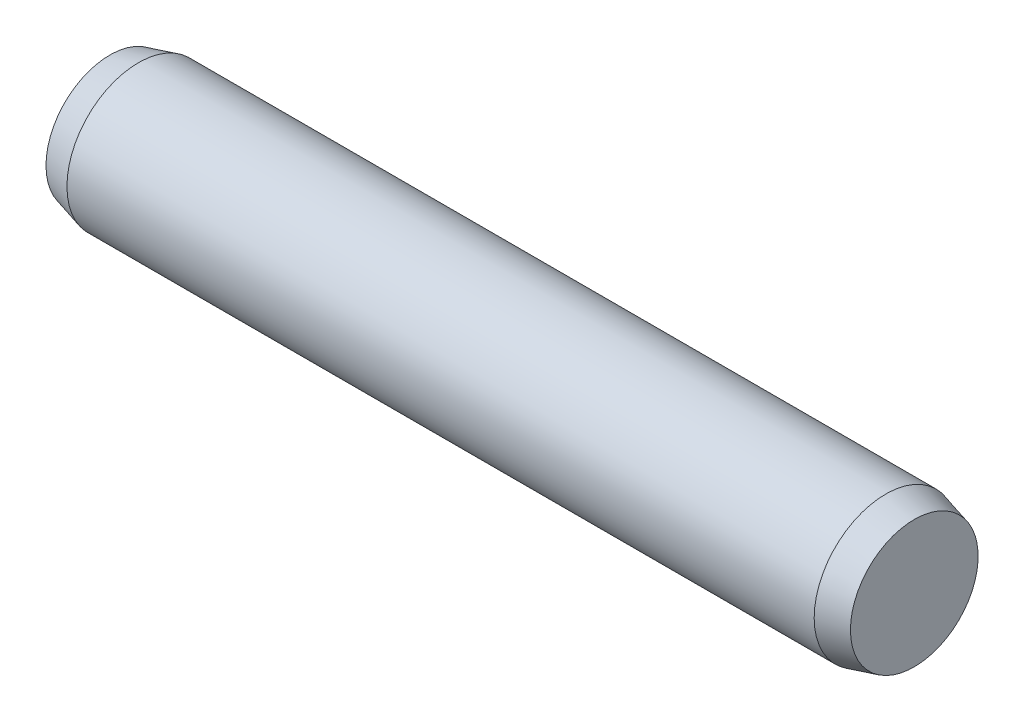
ISO-10303-21;
HEADER;
FILE_DESCRIPTION(('STEP AP214'),'2;1');
FILE_NAME('part.step','',(''),(''),'','','');
FILE_SCHEMA(('AUTOMOTIVE_DESIGN { 1 0 10303 214 1 1 1 1 }'));
ENDSEC;
DATA;
#1=APPLICATION_CONTEXT('core data for automotive mechanical design processes');
#2=APPLICATION_PROTOCOL_DEFINITION('international standard','automotive_design',2000,#1);
#3=PRODUCT_CONTEXT('',#1,'mechanical');
#4=PRODUCT('Part','Part','',(#3));
#5=PRODUCT_RELATED_PRODUCT_CATEGORY('part','',(#4));
#6=PRODUCT_DEFINITION_FORMATION('','',#4);
#7=PRODUCT_DEFINITION_CONTEXT('part definition',#1,'design');
#8=PRODUCT_DEFINITION('design','',#6,#7);
#9=PRODUCT_DEFINITION_SHAPE('','',#8);
#10=(LENGTH_UNIT() NAMED_UNIT(*) SI_UNIT(.MILLI.,.METRE.));
#11=(NAMED_UNIT(*) PLANE_ANGLE_UNIT() SI_UNIT($,.RADIAN.));
#12=(NAMED_UNIT(*) SI_UNIT($,.STERADIAN.) SOLID_ANGLE_UNIT());
#13=UNCERTAINTY_MEASURE_WITH_UNIT(LENGTH_MEASURE(1.E-05),#10,'distance_accuracy_value','');
#14=(GEOMETRIC_REPRESENTATION_CONTEXT(3) GLOBAL_UNCERTAINTY_ASSIGNED_CONTEXT((#13)) GLOBAL_UNIT_ASSIGNED_CONTEXT((#10,
#11,#12)) REPRESENTATION_CONTEXT('',''));
#15=CARTESIAN_POINT('',(0.,0.,0.));
#16=DIRECTION('',(0.,0.,1.));
#17=DIRECTION('',(1.,0.,0.));
#18=AXIS2_PLACEMENT_3D('',#15,#16,#17);
#19=CARTESIAN_POINT('',(0.,3.57128129211021,0.));
#20=DIRECTION('',(1.,0.,0.));
#21=DIRECTION('',(0.,0.,-1.));
#22=AXIS2_PLACEMENT_3D('',#19,#20,#21);
#23=PLANE('',#22);
#24=CARTESIAN_POINT('',(0.,0.,0.));
#25=DIRECTION('',(-1.,0.,0.));
#26=DIRECTION('',(0.,0.,1.));
#27=AXIS2_PLACEMENT_3D('',#24,#25,#26);
#28=CIRCLE('',#27,3.57128129211021);
#29=CARTESIAN_POINT('',(0.,0.,3.57128129211021));
#30=VERTEX_POINT('',#29);
#31=EDGE_CURVE('E51',#30,#30,#28,.T.);
#32=ORIENTED_EDGE('',*,*,#31,.T.);
#33=EDGE_LOOP('',(#32));
#34=FACE_BOUND('',#33,.T.);
#35=ADVANCED_FACE('F37',(#34),#23,.F.);
#36=CARTESIAN_POINT('',(45.,0.,0.));
#37=DIRECTION('',(-1.,0.,0.));
#38=DIRECTION('',(0.,0.,1.));
#39=AXIS2_PLACEMENT_3D('',#36,#37,#38);
#40=PLANE('',#39);
#41=CARTESIAN_POINT('',(45.,0.,0.));
#42=DIRECTION('',(-1.,0.,0.));
#43=DIRECTION('',(0.,0.,1.));
#44=AXIS2_PLACEMENT_3D('',#41,#42,#43);
#45=CIRCLE('',#44,3.57128129211021);
#46=CARTESIAN_POINT('',(45.,0.,3.57128129211021));
#47=VERTEX_POINT('',#46);
#48=EDGE_CURVE('E10',#47,#47,#45,.T.);
#49=ORIENTED_EDGE('',*,*,#48,.F.);
#50=EDGE_LOOP('',(#49));
#51=FACE_BOUND('',#50,.T.);
#52=ADVANCED_FACE('F71',(#51),#40,.F.);
#53=CARTESIAN_POINT('',(45.,0.,0.));
#54=DIRECTION('',(-1.,0.,0.));
#55=DIRECTION('',(0.,0.,1.));
#56=AXIS2_PLACEMENT_3D('',#53,#54,#55);
#57=CONICAL_SURFACE('',#56,3.57128129211021,0.26179938779915);
#58=CARTESIAN_POINT('',(43.4,0.,0.));
#59=DIRECTION('',(-1.,0.,0.));
#60=DIRECTION('',(0.,0.,1.));
#61=AXIS2_PLACEMENT_3D('',#58,#59,#60);
#62=CIRCLE('',#61,4.00000000000001);
#63=CARTESIAN_POINT('',(43.4,0.,4.00000000000001));
#64=VERTEX_POINT('',#63);
#65=EDGE_CURVE('E43',#64,#64,#62,.T.);
#66=ORIENTED_EDGE('',*,*,#65,.F.);
#67=EDGE_LOOP('',(#66));
#68=FACE_BOUND('',#67,.T.);
#69=ORIENTED_EDGE('',*,*,#48,.T.);
#70=EDGE_LOOP('',(#69));
#71=FACE_BOUND('',#70,.T.);
#72=ADVANCED_FACE('F66',(#68,#71),#57,.T.);
#73=CARTESIAN_POINT('',(-6.35,0.,0.));
#74=DIRECTION('',(-1.,0.,0.));
#75=DIRECTION('',(0.,0.,1.));
#76=AXIS2_PLACEMENT_3D('',#73,#74,#75);
#77=CYLINDRICAL_SURFACE('',#76,4.);
#78=CARTESIAN_POINT('',(1.6,0.,0.));
#79=DIRECTION('',(-1.,0.,0.));
#80=DIRECTION('',(0.,0.,1.));
#81=AXIS2_PLACEMENT_3D('',#78,#79,#80);
#82=CIRCLE('',#81,4.);
#83=CARTESIAN_POINT('',(1.6,0.,4.));
#84=VERTEX_POINT('',#83);
#85=EDGE_CURVE('E47',#84,#84,#82,.T.);
#86=ORIENTED_EDGE('',*,*,#85,.F.);
#87=EDGE_LOOP('',(#86));
#88=FACE_BOUND('',#87,.T.);
#89=ORIENTED_EDGE('',*,*,#65,.T.);
#90=EDGE_LOOP('',(#89));
#91=FACE_BOUND('',#90,.T.);
#92=ADVANCED_FACE('F61',(#88,#91),#77,.T.);
#93=CARTESIAN_POINT('',(1.6,0.,0.));
#94=DIRECTION('',(1.,0.,0.));
#95=DIRECTION('',(0.,0.,-1.));
#96=AXIS2_PLACEMENT_3D('',#93,#94,#95);
#97=CONICAL_SURFACE('',#96,4.,0.261799387799143);
#98=ORIENTED_EDGE('',*,*,#31,.F.);
#99=EDGE_LOOP('',(#98));
#100=FACE_BOUND('',#99,.T.);
#101=ORIENTED_EDGE('',*,*,#85,.T.);
#102=EDGE_LOOP('',(#101));
#103=FACE_BOUND('',#102,.T.);
#104=ADVANCED_FACE('F58',(#100,#103),#97,.T.);
#105=CLOSED_SHELL('',(#35,#52,#72,#92,#104));
#106=MANIFOLD_SOLID_BREP('B2',#105);
#107=ADVANCED_BREP_SHAPE_REPRESENTATION('',(#18,#106),#14);
#108=SHAPE_DEFINITION_REPRESENTATION(#9,#107);
ENDSEC;
END-ISO-10303-21;
